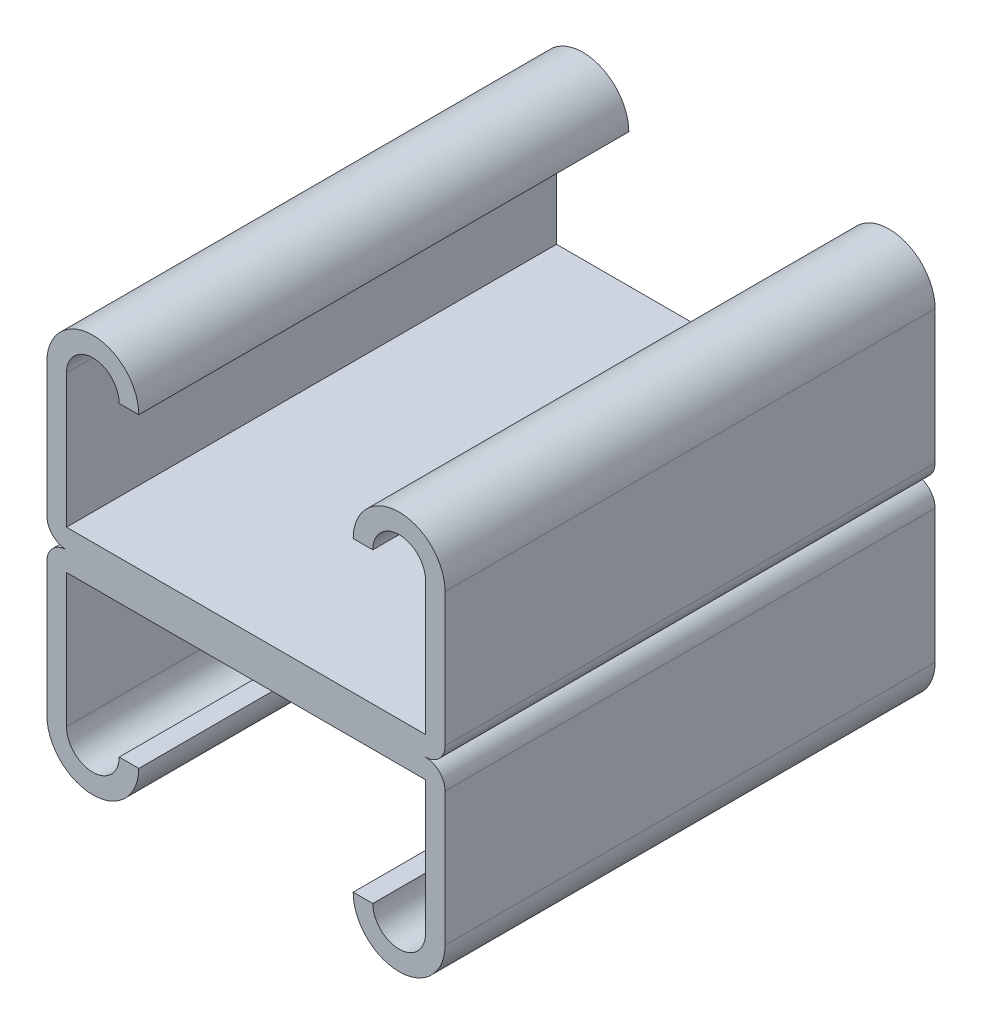
ISO-10303-21;
HEADER;
FILE_DESCRIPTION(('STEP AP214'),'2;1');
FILE_NAME('part.step','',(''),(''),'','','');
FILE_SCHEMA(('AUTOMOTIVE_DESIGN { 1 0 10303 214 1 1 1 1 }'));
ENDSEC;
DATA;
#1=APPLICATION_CONTEXT('core data for automotive mechanical design processes');
#2=APPLICATION_PROTOCOL_DEFINITION('international standard','automotive_design',2000,#1);
#3=PRODUCT_CONTEXT('',#1,'mechanical');
#4=PRODUCT('Part','Part','',(#3));
#5=PRODUCT_RELATED_PRODUCT_CATEGORY('part','',(#4));
#6=PRODUCT_DEFINITION_FORMATION('','',#4);
#7=PRODUCT_DEFINITION_CONTEXT('part definition',#1,'design');
#8=PRODUCT_DEFINITION('design','',#6,#7);
#9=PRODUCT_DEFINITION_SHAPE('','',#8);
#10=(LENGTH_UNIT() NAMED_UNIT(*) SI_UNIT(.MILLI.,.METRE.));
#11=(NAMED_UNIT(*) PLANE_ANGLE_UNIT() SI_UNIT($,.RADIAN.));
#12=(NAMED_UNIT(*) SI_UNIT($,.STERADIAN.) SOLID_ANGLE_UNIT());
#13=UNCERTAINTY_MEASURE_WITH_UNIT(LENGTH_MEASURE(1.E-05),#10,'distance_accuracy_value','');
#14=(GEOMETRIC_REPRESENTATION_CONTEXT(3) GLOBAL_UNCERTAINTY_ASSIGNED_CONTEXT((#13)) GLOBAL_UNIT_ASSIGNED_CONTEXT((#10,
#11,#12)) REPRESENTATION_CONTEXT('',''));
#15=CARTESIAN_POINT('',(0.,0.,0.));
#16=DIRECTION('',(0.,0.,1.));
#17=DIRECTION('',(1.,0.,0.));
#18=AXIS2_PLACEMENT_3D('',#15,#16,#17);
#19=CARTESIAN_POINT('',(-7.9375,7.9375,12.7));
#20=DIRECTION('',(0.,0.,-1.));
#21=DIRECTION('',(-1.,0.,0.));
#22=AXIS2_PLACEMENT_3D('',#19,#20,#21);
#23=CYLINDRICAL_SURFACE('',#22,2.38125);
#24=CARTESIAN_POINT('',(-7.9375,7.9375,-12.7));
#25=DIRECTION('',(0.,0.,1.));
#26=DIRECTION('',(-1.,0.,0.));
#27=AXIS2_PLACEMENT_3D('',#24,#25,#26);
#28=CIRCLE('',#27,2.38125);
#29=CARTESIAN_POINT('',(-5.55625,7.9375,-12.7));
#30=VERTEX_POINT('',#29);
#31=CARTESIAN_POINT('',(-10.31875,7.9375,-12.7));
#32=VERTEX_POINT('',#31);
#33=EDGE_CURVE('E165',#30,#32,#28,.T.);
#34=ORIENTED_EDGE('',*,*,#33,.T.);
#35=DIRECTION('',(0.,0.,-1.));
#36=VECTOR('',#35,1.);
#37=CARTESIAN_POINT('',(-10.31875,7.9375,12.7));
#38=LINE('',#37,#36);
#39=CARTESIAN_POINT('',(-10.31875,7.9375,12.7));
#40=VERTEX_POINT('',#39);
#41=EDGE_CURVE('E11',#40,#32,#38,.T.);
#42=ORIENTED_EDGE('',*,*,#41,.F.);
#43=CARTESIAN_POINT('',(-7.9375,7.9375,12.7));
#44=DIRECTION('',(0.,0.,1.));
#45=DIRECTION('',(-1.,0.,0.));
#46=AXIS2_PLACEMENT_3D('',#43,#44,#45);
#47=CIRCLE('',#46,2.38125);
#48=CARTESIAN_POINT('',(-5.55625,7.9375,12.7));
#49=VERTEX_POINT('',#48);
#50=EDGE_CURVE('E190',#49,#40,#47,.T.);
#51=ORIENTED_EDGE('',*,*,#50,.F.);
#52=DIRECTION('',(0.,0.,-1.));
#53=VECTOR('',#52,1.);
#54=CARTESIAN_POINT('',(-5.55625,7.9375,12.7));
#55=LINE('',#54,#53);
#56=EDGE_CURVE('E161',#49,#30,#55,.T.);
#57=ORIENTED_EDGE('',*,*,#56,.T.);
#58=EDGE_LOOP('',(#34,#42,#51,#57));
#59=FACE_BOUND('',#58,.T.);
#60=ADVANCED_FACE('F32',(#59),#23,.T.);
#61=CARTESIAN_POINT('',(-10.31875,7.9375,12.7));
#62=DIRECTION('',(1.,0.,0.));
#63=DIRECTION('',(0.,1.,0.));
#64=AXIS2_PLACEMENT_3D('',#61,#62,#63);
#65=PLANE('',#64);
#66=DIRECTION('',(0.,-1.,0.));
#67=VECTOR('',#66,1.);
#68=CARTESIAN_POINT('',(-10.31875,7.9375,-12.7));
#69=LINE('',#68,#67);
#70=CARTESIAN_POINT('',(-10.31875,1.016,-12.7));
#71=VERTEX_POINT('',#70);
#72=EDGE_CURVE('E168',#32,#71,#69,.T.);
#73=ORIENTED_EDGE('',*,*,#72,.T.);
#74=DIRECTION('',(0.,0.,-1.));
#75=VECTOR('',#74,1.);
#76=CARTESIAN_POINT('',(-10.31875,1.016,12.7));
#77=LINE('',#76,#75);
#78=CARTESIAN_POINT('',(-10.31875,1.016,12.7));
#79=VERTEX_POINT('',#78);
#80=EDGE_CURVE('E40',#79,#71,#77,.T.);
#81=ORIENTED_EDGE('',*,*,#80,.F.);
#82=DIRECTION('',(0.,-1.,0.));
#83=VECTOR('',#82,1.);
#84=CARTESIAN_POINT('',(-10.31875,7.9375,12.7));
#85=LINE('',#84,#83);
#86=EDGE_CURVE('E107',#40,#79,#85,.T.);
#87=ORIENTED_EDGE('',*,*,#86,.F.);
#88=ORIENTED_EDGE('',*,*,#41,.T.);
#89=EDGE_LOOP('',(#73,#81,#87,#88));
#90=FACE_BOUND('',#89,.T.);
#91=ADVANCED_FACE('F320',(#90),#65,.F.);
#92=CARTESIAN_POINT('',(-9.30275,1.016,12.7));
#93=DIRECTION('',(0.,0.,-1.));
#94=DIRECTION('',(-1.,0.,0.));
#95=AXIS2_PLACEMENT_3D('',#92,#93,#94);
#96=CYLINDRICAL_SURFACE('',#95,1.016);
#97=CARTESIAN_POINT('',(-9.30275,1.016,-12.7));
#98=DIRECTION('',(0.,0.,1.));
#99=DIRECTION('',(-1.,0.,0.));
#100=AXIS2_PLACEMENT_3D('',#97,#98,#99);
#101=CIRCLE('',#100,1.016);
#102=CARTESIAN_POINT('',(-9.30275,0.,-12.7));
#103=VERTEX_POINT('',#102);
#104=EDGE_CURVE('E171',#71,#103,#101,.T.);
#105=ORIENTED_EDGE('',*,*,#104,.T.);
#106=DIRECTION('',(0.,0.,-1.));
#107=VECTOR('',#106,1.);
#108=CARTESIAN_POINT('',(-9.30275,0.,12.7));
#109=LINE('',#108,#107);
#110=CARTESIAN_POINT('',(-9.30275,0.,12.7));
#111=VERTEX_POINT('',#110);
#112=EDGE_CURVE('E215',#111,#103,#109,.T.);
#113=ORIENTED_EDGE('',*,*,#112,.F.);
#114=CARTESIAN_POINT('',(-9.30275,1.016,12.7));
#115=DIRECTION('',(0.,0.,1.));
#116=DIRECTION('',(-1.,0.,0.));
#117=AXIS2_PLACEMENT_3D('',#114,#115,#116);
#118=CIRCLE('',#117,1.016);
#119=EDGE_CURVE('E223',#79,#111,#118,.T.);
#120=ORIENTED_EDGE('',*,*,#119,.F.);
#121=ORIENTED_EDGE('',*,*,#80,.T.);
#122=EDGE_LOOP('',(#105,#113,#120,#121));
#123=FACE_BOUND('',#122,.T.);
#124=ADVANCED_FACE('F221',(#123),#96,.T.);
#125=CARTESIAN_POINT('',(9.30275,1.016,12.7));
#126=DIRECTION('',(0.,0.,-1.));
#127=DIRECTION('',(-1.,0.,0.));
#128=AXIS2_PLACEMENT_3D('',#125,#126,#127);
#129=CYLINDRICAL_SURFACE('',#128,1.016);
#130=CARTESIAN_POINT('',(9.30275,1.016,-12.7));
#131=DIRECTION('',(0.,0.,1.));
#132=DIRECTION('',(1.,0.,0.));
#133=AXIS2_PLACEMENT_3D('',#130,#131,#132);
#134=CIRCLE('',#133,1.016);
#135=CARTESIAN_POINT('',(9.30275,0.,-12.7));
#136=VERTEX_POINT('',#135);
#137=CARTESIAN_POINT('',(10.31875,1.016,-12.7));
#138=VERTEX_POINT('',#137);
#139=EDGE_CURVE('E173',#136,#138,#134,.T.);
#140=ORIENTED_EDGE('',*,*,#139,.T.);
#141=DIRECTION('',(0.,0.,-1.));
#142=VECTOR('',#141,1.);
#143=CARTESIAN_POINT('',(10.31875,1.016,12.7));
#144=LINE('',#143,#142);
#145=CARTESIAN_POINT('',(10.31875,1.016,12.7));
#146=VERTEX_POINT('',#145);
#147=EDGE_CURVE('E209',#146,#138,#144,.T.);
#148=ORIENTED_EDGE('',*,*,#147,.F.);
#149=CARTESIAN_POINT('',(9.30275,1.016,12.7));
#150=DIRECTION('',(0.,0.,1.));
#151=DIRECTION('',(1.,0.,0.));
#152=AXIS2_PLACEMENT_3D('',#149,#150,#151);
#153=CIRCLE('',#152,1.016);
#154=CARTESIAN_POINT('',(9.30275,0.,12.7));
#155=VERTEX_POINT('',#154);
#156=EDGE_CURVE('E285',#155,#146,#153,.T.);
#157=ORIENTED_EDGE('',*,*,#156,.F.);
#158=DIRECTION('',(0.,0.,-1.));
#159=VECTOR('',#158,1.);
#160=CARTESIAN_POINT('',(9.30275,0.,12.7));
#161=LINE('',#160,#159);
#162=EDGE_CURVE('E212',#155,#136,#161,.T.);
#163=ORIENTED_EDGE('',*,*,#162,.T.);
#164=EDGE_LOOP('',(#140,#148,#157,#163));
#165=FACE_BOUND('',#164,.T.);
#166=ADVANCED_FACE('F327',(#165),#129,.T.);
#167=CARTESIAN_POINT('',(10.31875,1.016,12.7));
#168=DIRECTION('',(-1.,0.,0.));
#169=DIRECTION('',(0.,-1.,0.));
#170=AXIS2_PLACEMENT_3D('',#167,#168,#169);
#171=PLANE('',#170);
#172=DIRECTION('',(0.,1.,0.));
#173=VECTOR('',#172,1.);
#174=CARTESIAN_POINT('',(10.31875,1.016,-12.7));
#175=LINE('',#174,#173);
#176=CARTESIAN_POINT('',(10.31875,7.9375,-12.7));
#177=VERTEX_POINT('',#176);
#178=EDGE_CURVE('E175',#138,#177,#175,.T.);
#179=ORIENTED_EDGE('',*,*,#178,.T.);
#180=DIRECTION('',(0.,0.,-1.));
#181=VECTOR('',#180,1.);
#182=CARTESIAN_POINT('',(10.31875,7.9375,12.7));
#183=LINE('',#182,#181);
#184=CARTESIAN_POINT('',(10.31875,7.9375,12.7));
#185=VERTEX_POINT('',#184);
#186=EDGE_CURVE('E206',#185,#177,#183,.T.);
#187=ORIENTED_EDGE('',*,*,#186,.F.);
#188=DIRECTION('',(0.,1.,0.));
#189=VECTOR('',#188,1.);
#190=CARTESIAN_POINT('',(10.31875,1.016,12.7));
#191=LINE('',#190,#189);
#192=EDGE_CURVE('E287',#146,#185,#191,.T.);
#193=ORIENTED_EDGE('',*,*,#192,.F.);
#194=ORIENTED_EDGE('',*,*,#147,.T.);
#195=EDGE_LOOP('',(#179,#187,#193,#194));
#196=FACE_BOUND('',#195,.T.);
#197=ADVANCED_FACE('F332',(#196),#171,.F.);
#198=CARTESIAN_POINT('',(7.9375,7.9375,12.7));
#199=DIRECTION('',(0.,0.,-1.));
#200=DIRECTION('',(-1.,0.,0.));
#201=AXIS2_PLACEMENT_3D('',#198,#199,#200);
#202=CYLINDRICAL_SURFACE('',#201,2.38125);
#203=CARTESIAN_POINT('',(7.9375,7.9375,-12.7));
#204=DIRECTION('',(0.,0.,1.));
#205=DIRECTION('',(1.,0.,0.));
#206=AXIS2_PLACEMENT_3D('',#203,#204,#205);
#207=CIRCLE('',#206,2.38125);
#208=CARTESIAN_POINT('',(5.55625,7.9375,-12.7));
#209=VERTEX_POINT('',#208);
#210=EDGE_CURVE('E177',#177,#209,#207,.T.);
#211=ORIENTED_EDGE('',*,*,#210,.T.);
#212=DIRECTION('',(0.,0.,-1.));
#213=VECTOR('',#212,1.);
#214=CARTESIAN_POINT('',(5.55625,7.9375,12.7));
#215=LINE('',#214,#213);
#216=CARTESIAN_POINT('',(5.55625,7.9375,12.7));
#217=VERTEX_POINT('',#216);
#218=EDGE_CURVE('E203',#217,#209,#215,.T.);
#219=ORIENTED_EDGE('',*,*,#218,.F.);
#220=CARTESIAN_POINT('',(7.9375,7.9375,12.7));
#221=DIRECTION('',(0.,0.,1.));
#222=DIRECTION('',(1.,0.,0.));
#223=AXIS2_PLACEMENT_3D('',#220,#221,#222);
#224=CIRCLE('',#223,2.38125);
#225=EDGE_CURVE('E289',#185,#217,#224,.T.);
#226=ORIENTED_EDGE('',*,*,#225,.F.);
#227=ORIENTED_EDGE('',*,*,#186,.T.);
#228=EDGE_LOOP('',(#211,#219,#226,#227));
#229=FACE_BOUND('',#228,.T.);
#230=ADVANCED_FACE('F336',(#229),#202,.T.);
#231=CARTESIAN_POINT('',(5.55625,7.9375,12.7));
#232=DIRECTION('',(0.,1.,0.));
#233=DIRECTION('',(0.,0.,1.));
#234=AXIS2_PLACEMENT_3D('',#231,#232,#233);
#235=PLANE('',#234);
#236=DIRECTION('',(1.,0.,0.));
#237=VECTOR('',#236,1.);
#238=CARTESIAN_POINT('',(5.55625,7.9375,-12.7));
#239=LINE('',#238,#237);
#240=CARTESIAN_POINT('',(6.57225,7.9375,-12.7));
#241=VERTEX_POINT('',#240);
#242=EDGE_CURVE('E179',#209,#241,#239,.T.);
#243=ORIENTED_EDGE('',*,*,#242,.T.);
#244=DIRECTION('',(0.,0.,-1.));
#245=VECTOR('',#244,1.);
#246=CARTESIAN_POINT('',(6.57225,7.9375,12.7));
#247=LINE('',#246,#245);
#248=CARTESIAN_POINT('',(6.57225,7.9375,12.7));
#249=VERTEX_POINT('',#248);
#250=EDGE_CURVE('E200',#249,#241,#247,.T.);
#251=ORIENTED_EDGE('',*,*,#250,.F.);
#252=DIRECTION('',(1.,0.,0.));
#253=VECTOR('',#252,1.);
#254=CARTESIAN_POINT('',(5.55625,7.9375,12.7));
#255=LINE('',#254,#253);
#256=EDGE_CURVE('E291',#217,#249,#255,.T.);
#257=ORIENTED_EDGE('',*,*,#256,.F.);
#258=ORIENTED_EDGE('',*,*,#218,.T.);
#259=EDGE_LOOP('',(#243,#251,#257,#258));
#260=FACE_BOUND('',#259,.T.);
#261=ADVANCED_FACE('F340',(#260),#235,.F.);
#262=CARTESIAN_POINT('',(7.9375,7.9375,12.7));
#263=DIRECTION('',(0.,0.,-1.));
#264=DIRECTION('',(-1.,0.,0.));
#265=AXIS2_PLACEMENT_3D('',#262,#263,#264);
#266=CYLINDRICAL_SURFACE('',#265,1.36525);
#267=CARTESIAN_POINT('',(7.9375,7.9375,-12.7));
#268=DIRECTION('',(0.,0.,-1.));
#269=DIRECTION('',(1.,0.,0.));
#270=AXIS2_PLACEMENT_3D('',#267,#268,#269);
#271=CIRCLE('',#270,1.36525);
#272=CARTESIAN_POINT('',(9.30275,7.9375,-12.7));
#273=VERTEX_POINT('',#272);
#274=EDGE_CURVE('E181',#241,#273,#271,.T.);
#275=ORIENTED_EDGE('',*,*,#274,.T.);
#276=DIRECTION('',(0.,0.,-1.));
#277=VECTOR('',#276,1.);
#278=CARTESIAN_POINT('',(9.30275,7.9375,12.7));
#279=LINE('',#278,#277);
#280=CARTESIAN_POINT('',(9.30275,7.9375,12.7));
#281=VERTEX_POINT('',#280);
#282=EDGE_CURVE('E197',#281,#273,#279,.T.);
#283=ORIENTED_EDGE('',*,*,#282,.F.);
#284=CARTESIAN_POINT('',(7.9375,7.9375,12.7));
#285=DIRECTION('',(0.,0.,-1.));
#286=DIRECTION('',(1.,0.,0.));
#287=AXIS2_PLACEMENT_3D('',#284,#285,#286);
#288=CIRCLE('',#287,1.36525);
#289=EDGE_CURVE('E293',#249,#281,#288,.T.);
#290=ORIENTED_EDGE('',*,*,#289,.F.);
#291=ORIENTED_EDGE('',*,*,#250,.T.);
#292=EDGE_LOOP('',(#275,#283,#290,#291));
#293=FACE_BOUND('',#292,.T.);
#294=ADVANCED_FACE('F344',(#293),#266,.F.);
#295=CARTESIAN_POINT('',(9.30275,1.016,12.7));
#296=DIRECTION('',(1.,0.,0.));
#297=DIRECTION('',(0.,1.,0.));
#298=AXIS2_PLACEMENT_3D('',#295,#296,#297);
#299=PLANE('',#298);
#300=DIRECTION('',(0.,-1.,0.));
#301=VECTOR('',#300,1.);
#302=CARTESIAN_POINT('',(9.30275,1.016,-12.7));
#303=LINE('',#302,#301);
#304=CARTESIAN_POINT('',(9.30275,1.016,-12.7));
#305=VERTEX_POINT('',#304);
#306=EDGE_CURVE('E183',#273,#305,#303,.T.);
#307=ORIENTED_EDGE('',*,*,#306,.T.);
#308=DIRECTION('',(0.,0.,-1.));
#309=VECTOR('',#308,1.);
#310=CARTESIAN_POINT('',(9.30275,1.016,12.7));
#311=LINE('',#310,#309);
#312=CARTESIAN_POINT('',(9.30275,1.016,12.7));
#313=VERTEX_POINT('',#312);
#314=EDGE_CURVE('E194',#313,#305,#311,.T.);
#315=ORIENTED_EDGE('',*,*,#314,.F.);
#316=DIRECTION('',(0.,-1.,0.));
#317=VECTOR('',#316,1.);
#318=CARTESIAN_POINT('',(9.30275,1.016,12.7));
#319=LINE('',#318,#317);
#320=EDGE_CURVE('E295',#281,#313,#319,.T.);
#321=ORIENTED_EDGE('',*,*,#320,.F.);
#322=ORIENTED_EDGE('',*,*,#282,.T.);
#323=EDGE_LOOP('',(#307,#315,#321,#322));
#324=FACE_BOUND('',#323,.T.);
#325=ADVANCED_FACE('F301',(#324),#299,.F.);
#326=CARTESIAN_POINT('',(-9.30275,1.016,12.7));
#327=DIRECTION('',(0.,-1.,0.));
#328=DIRECTION('',(1.,0.,0.));
#329=AXIS2_PLACEMENT_3D('',#326,#327,#328);
#330=PLANE('',#329);
#331=DIRECTION('',(-1.,0.,0.));
#332=VECTOR('',#331,1.);
#333=CARTESIAN_POINT('',(-9.30275,1.016,-12.7));
#334=LINE('',#333,#332);
#335=CARTESIAN_POINT('',(-9.30275,1.016,-12.7));
#336=VERTEX_POINT('',#335);
#337=EDGE_CURVE('E185',#305,#336,#334,.T.);
#338=ORIENTED_EDGE('',*,*,#337,.T.);
#339=DIRECTION('',(0.,0.,-1.));
#340=VECTOR('',#339,1.);
#341=CARTESIAN_POINT('',(-9.30275,1.016,12.7));
#342=LINE('',#341,#340);
#343=CARTESIAN_POINT('',(-9.30275,1.016,12.7));
#344=VERTEX_POINT('',#343);
#345=EDGE_CURVE('E156',#344,#336,#342,.T.);
#346=ORIENTED_EDGE('',*,*,#345,.F.);
#347=DIRECTION('',(-1.,0.,0.));
#348=VECTOR('',#347,1.);
#349=CARTESIAN_POINT('',(-9.30275,1.016,12.7));
#350=LINE('',#349,#348);
#351=EDGE_CURVE('E147',#313,#344,#350,.T.);
#352=ORIENTED_EDGE('',*,*,#351,.F.);
#353=ORIENTED_EDGE('',*,*,#314,.T.);
#354=EDGE_LOOP('',(#338,#346,#352,#353));
#355=FACE_BOUND('',#354,.T.);
#356=ADVANCED_FACE('F305',(#355),#330,.F.);
#357=CARTESIAN_POINT('',(-9.30275,7.9375,12.7));
#358=DIRECTION('',(-1.,0.,0.));
#359=DIRECTION('',(0.,-1.,0.));
#360=AXIS2_PLACEMENT_3D('',#357,#358,#359);
#361=PLANE('',#360);
#362=DIRECTION('',(0.,1.,0.));
#363=VECTOR('',#362,1.);
#364=CARTESIAN_POINT('',(-9.30275,7.9375,-12.7));
#365=LINE('',#364,#363);
#366=CARTESIAN_POINT('',(-9.30275,7.9375,-12.7));
#367=VERTEX_POINT('',#366);
#368=EDGE_CURVE('E155',#336,#367,#365,.T.);
#369=ORIENTED_EDGE('',*,*,#368,.T.);
#370=DIRECTION('',(0.,0.,-1.));
#371=VECTOR('',#370,1.);
#372=CARTESIAN_POINT('',(-9.30275,7.9375,12.7));
#373=LINE('',#372,#371);
#374=CARTESIAN_POINT('',(-9.30275,7.9375,12.7));
#375=VERTEX_POINT('',#374);
#376=EDGE_CURVE('E152',#375,#367,#373,.T.);
#377=ORIENTED_EDGE('',*,*,#376,.F.);
#378=DIRECTION('',(0.,1.,0.));
#379=VECTOR('',#378,1.);
#380=CARTESIAN_POINT('',(-9.30275,7.9375,12.7));
#381=LINE('',#380,#379);
#382=EDGE_CURVE('E141',#344,#375,#381,.T.);
#383=ORIENTED_EDGE('',*,*,#382,.F.);
#384=ORIENTED_EDGE('',*,*,#345,.T.);
#385=EDGE_LOOP('',(#369,#377,#383,#384));
#386=FACE_BOUND('',#385,.T.);
#387=ADVANCED_FACE('F153',(#386),#361,.F.);
#388=CARTESIAN_POINT('',(-7.9375,7.9375,12.7));
#389=DIRECTION('',(0.,0.,-1.));
#390=DIRECTION('',(-1.,0.,0.));
#391=AXIS2_PLACEMENT_3D('',#388,#389,#390);
#392=CYLINDRICAL_SURFACE('',#391,1.36525);
#393=CARTESIAN_POINT('',(-7.9375,7.9375,-12.7));
#394=DIRECTION('',(0.,0.,-1.));
#395=DIRECTION('',(-1.,0.,0.));
#396=AXIS2_PLACEMENT_3D('',#393,#394,#395);
#397=CIRCLE('',#396,1.36525);
#398=CARTESIAN_POINT('',(-6.57225,7.9375,-12.7));
#399=VERTEX_POINT('',#398);
#400=EDGE_CURVE('E93',#367,#399,#397,.T.);
#401=ORIENTED_EDGE('',*,*,#400,.T.);
#402=DIRECTION('',(0.,0.,-1.));
#403=VECTOR('',#402,1.);
#404=CARTESIAN_POINT('',(-6.57225,7.9375,12.7));
#405=LINE('',#404,#403);
#406=CARTESIAN_POINT('',(-6.57225,7.9375,12.7));
#407=VERTEX_POINT('',#406);
#408=EDGE_CURVE('E157',#407,#399,#405,.T.);
#409=ORIENTED_EDGE('',*,*,#408,.F.);
#410=CARTESIAN_POINT('',(-7.9375,7.9375,12.7));
#411=DIRECTION('',(0.,0.,-1.));
#412=DIRECTION('',(-1.,0.,0.));
#413=AXIS2_PLACEMENT_3D('',#410,#411,#412);
#414=CIRCLE('',#413,1.36525);
#415=EDGE_CURVE('E145',#375,#407,#414,.T.);
#416=ORIENTED_EDGE('',*,*,#415,.F.);
#417=ORIENTED_EDGE('',*,*,#376,.T.);
#418=EDGE_LOOP('',(#401,#409,#416,#417));
#419=FACE_BOUND('',#418,.T.);
#420=ADVANCED_FACE('F159',(#419),#392,.F.);
#421=CARTESIAN_POINT('',(-6.57225,7.9375,12.7));
#422=DIRECTION('',(0.,1.,0.));
#423=DIRECTION('',(0.,0.,1.));
#424=AXIS2_PLACEMENT_3D('',#421,#422,#423);
#425=PLANE('',#424);
#426=DIRECTION('',(1.,0.,0.));
#427=VECTOR('',#426,1.);
#428=CARTESIAN_POINT('',(-6.57225,7.9375,-12.7));
#429=LINE('',#428,#427);
#430=EDGE_CURVE('E99',#399,#30,#429,.T.);
#431=ORIENTED_EDGE('',*,*,#430,.T.);
#432=ORIENTED_EDGE('',*,*,#56,.F.);
#433=DIRECTION('',(1.,0.,0.));
#434=VECTOR('',#433,1.);
#435=CARTESIAN_POINT('',(-6.57225,7.9375,12.7));
#436=LINE('',#435,#434);
#437=EDGE_CURVE('E48',#407,#49,#436,.T.);
#438=ORIENTED_EDGE('',*,*,#437,.F.);
#439=ORIENTED_EDGE('',*,*,#408,.T.);
#440=EDGE_LOOP('',(#431,#432,#438,#439));
#441=FACE_BOUND('',#440,.T.);
#442=ADVANCED_FACE('F309',(#441),#425,.F.);
#443=CARTESIAN_POINT('',(-7.9375,7.9375,12.7));
#444=DIRECTION('',(0.,0.,-1.));
#445=DIRECTION('',(-1.,0.,0.));
#446=AXIS2_PLACEMENT_3D('',#443,#444,#445);
#447=PLANE('',#446);
#448=ORIENTED_EDGE('',*,*,#50,.T.);
#449=ORIENTED_EDGE('',*,*,#86,.T.);
#450=ORIENTED_EDGE('',*,*,#119,.T.);
#451=CARTESIAN_POINT('',(-9.30275,-1.016,12.7));
#452=DIRECTION('',(0.,0.,-1.));
#453=DIRECTION('',(-1.,0.,0.));
#454=AXIS2_PLACEMENT_3D('',#451,#452,#453);
#455=CIRCLE('',#454,1.016);
#456=CARTESIAN_POINT('',(-10.31875,-1.016,12.7));
#457=VERTEX_POINT('',#456);
#458=EDGE_CURVE('E630',#457,#111,#455,.T.);
#459=ORIENTED_EDGE('',*,*,#458,.F.);
#460=DIRECTION('',(0.,1.,0.));
#461=VECTOR('',#460,1.);
#462=CARTESIAN_POINT('',(-10.31875,-7.9375,12.7));
#463=LINE('',#462,#461);
#464=CARTESIAN_POINT('',(-10.31875,-7.9375,12.7));
#465=VERTEX_POINT('',#464);
#466=EDGE_CURVE('E250',#465,#457,#463,.T.);
#467=ORIENTED_EDGE('',*,*,#466,.F.);
#468=CARTESIAN_POINT('',(-7.9375,-7.9375,12.7));
#469=DIRECTION('',(0.,0.,-1.));
#470=DIRECTION('',(-1.,0.,0.));
#471=AXIS2_PLACEMENT_3D('',#468,#469,#470);
#472=CIRCLE('',#471,2.38125);
#473=CARTESIAN_POINT('',(-5.55625,-7.9375,12.7));
#474=VERTEX_POINT('',#473);
#475=EDGE_CURVE('E239',#474,#465,#472,.T.);
#476=ORIENTED_EDGE('',*,*,#475,.F.);
#477=DIRECTION('',(1.,0.,0.));
#478=VECTOR('',#477,1.);
#479=CARTESIAN_POINT('',(-6.57225,-7.9375,12.7));
#480=LINE('',#479,#478);
#481=CARTESIAN_POINT('',(-6.57225,-7.9375,12.7));
#482=VERTEX_POINT('',#481);
#483=EDGE_CURVE('E591',#482,#474,#480,.T.);
#484=ORIENTED_EDGE('',*,*,#483,.F.);
#485=CARTESIAN_POINT('',(-7.9375,-7.9375,12.7));
#486=DIRECTION('',(0.,0.,1.));
#487=DIRECTION('',(-1.,0.,0.));
#488=AXIS2_PLACEMENT_3D('',#485,#486,#487);
#489=CIRCLE('',#488,1.36525);
#490=CARTESIAN_POINT('',(-9.30275,-7.9375,12.7));
#491=VERTEX_POINT('',#490);
#492=EDGE_CURVE('E600',#491,#482,#489,.T.);
#493=ORIENTED_EDGE('',*,*,#492,.F.);
#494=DIRECTION('',(0.,-1.,0.));
#495=VECTOR('',#494,1.);
#496=CARTESIAN_POINT('',(-9.30275,-7.9375,12.7));
#497=LINE('',#496,#495);
#498=CARTESIAN_POINT('',(-9.30275,-1.016,12.7));
#499=VERTEX_POINT('',#498);
#500=EDGE_CURVE('E604',#499,#491,#497,.T.);
#501=ORIENTED_EDGE('',*,*,#500,.F.);
#502=DIRECTION('',(-1.,0.,0.));
#503=VECTOR('',#502,1.);
#504=CARTESIAN_POINT('',(-9.30275,-1.016,12.7));
#505=LINE('',#504,#503);
#506=CARTESIAN_POINT('',(9.30275,-1.016,12.7));
#507=VERTEX_POINT('',#506);
#508=EDGE_CURVE('E606',#507,#499,#505,.T.);
#509=ORIENTED_EDGE('',*,*,#508,.F.);
#510=DIRECTION('',(0.,1.,0.));
#511=VECTOR('',#510,1.);
#512=CARTESIAN_POINT('',(9.30275,-1.016,12.7));
#513=LINE('',#512,#511);
#514=CARTESIAN_POINT('',(9.30275,-7.9375,12.7));
#515=VERTEX_POINT('',#514);
#516=EDGE_CURVE('E612',#515,#507,#513,.T.);
#517=ORIENTED_EDGE('',*,*,#516,.F.);
#518=CARTESIAN_POINT('',(7.9375,-7.9375,12.7));
#519=DIRECTION('',(0.,0.,1.));
#520=DIRECTION('',(1.,0.,0.));
#521=AXIS2_PLACEMENT_3D('',#518,#519,#520);
#522=CIRCLE('',#521,1.36525);
#523=CARTESIAN_POINT('',(6.57225,-7.9375,12.7));
#524=VERTEX_POINT('',#523);
#525=EDGE_CURVE('E615',#524,#515,#522,.T.);
#526=ORIENTED_EDGE('',*,*,#525,.F.);
#527=DIRECTION('',(1.,0.,0.));
#528=VECTOR('',#527,1.);
#529=CARTESIAN_POINT('',(5.55625,-7.9375,12.7));
#530=LINE('',#529,#528);
#531=CARTESIAN_POINT('',(5.55625,-7.9375,12.7));
#532=VERTEX_POINT('',#531);
#533=EDGE_CURVE('E618',#532,#524,#530,.T.);
#534=ORIENTED_EDGE('',*,*,#533,.F.);
#535=CARTESIAN_POINT('',(7.9375,-7.9375,12.7));
#536=DIRECTION('',(0.,0.,-1.));
#537=DIRECTION('',(1.,0.,0.));
#538=AXIS2_PLACEMENT_3D('',#535,#536,#537);
#539=CIRCLE('',#538,2.38125);
#540=CARTESIAN_POINT('',(10.31875,-7.9375,12.7));
#541=VERTEX_POINT('',#540);
#542=EDGE_CURVE('E621',#541,#532,#539,.T.);
#543=ORIENTED_EDGE('',*,*,#542,.F.);
#544=DIRECTION('',(0.,-1.,0.));
#545=VECTOR('',#544,1.);
#546=CARTESIAN_POINT('',(10.31875,-1.016,12.7));
#547=LINE('',#546,#545);
#548=CARTESIAN_POINT('',(10.31875,-1.016,12.7));
#549=VERTEX_POINT('',#548);
#550=EDGE_CURVE('E624',#549,#541,#547,.T.);
#551=ORIENTED_EDGE('',*,*,#550,.F.);
#552=CARTESIAN_POINT('',(9.30275,-1.016,12.7));
#553=DIRECTION('',(0.,0.,-1.));
#554=DIRECTION('',(1.,0.,0.));
#555=AXIS2_PLACEMENT_3D('',#552,#553,#554);
#556=CIRCLE('',#555,1.016);
#557=EDGE_CURVE('E627',#155,#549,#556,.T.);
#558=ORIENTED_EDGE('',*,*,#557,.F.);
#559=ORIENTED_EDGE('',*,*,#156,.T.);
#560=ORIENTED_EDGE('',*,*,#192,.T.);
#561=ORIENTED_EDGE('',*,*,#225,.T.);
#562=ORIENTED_EDGE('',*,*,#256,.T.);
#563=ORIENTED_EDGE('',*,*,#289,.T.);
#564=ORIENTED_EDGE('',*,*,#320,.T.);
#565=ORIENTED_EDGE('',*,*,#351,.T.);
#566=ORIENTED_EDGE('',*,*,#382,.T.);
#567=ORIENTED_EDGE('',*,*,#415,.T.);
#568=ORIENTED_EDGE('',*,*,#437,.T.);
#569=EDGE_LOOP('',(#448,#449,#450,#459,#467,#476,#484,#493,#501,#509,#517,#526,#534,#543,#551,
#558,#559,#560,#561,#562,#563,#564,#565,#566,#567,#568));
#570=FACE_BOUND('',#569,.T.);
#571=ADVANCED_FACE('F143',(#570),#447,.F.);
#572=CARTESIAN_POINT('',(-7.9375,7.9375,-12.7));
#573=DIRECTION('',(0.,0.,-1.));
#574=DIRECTION('',(-1.,0.,0.));
#575=AXIS2_PLACEMENT_3D('',#572,#573,#574);
#576=PLANE('',#575);
#577=ORIENTED_EDGE('',*,*,#33,.F.);
#578=ORIENTED_EDGE('',*,*,#430,.F.);
#579=ORIENTED_EDGE('',*,*,#400,.F.);
#580=ORIENTED_EDGE('',*,*,#368,.F.);
#581=ORIENTED_EDGE('',*,*,#337,.F.);
#582=ORIENTED_EDGE('',*,*,#306,.F.);
#583=ORIENTED_EDGE('',*,*,#274,.F.);
#584=ORIENTED_EDGE('',*,*,#242,.F.);
#585=ORIENTED_EDGE('',*,*,#210,.F.);
#586=ORIENTED_EDGE('',*,*,#178,.F.);
#587=ORIENTED_EDGE('',*,*,#139,.F.);
#588=CARTESIAN_POINT('',(9.30275,-1.016,-12.7));
#589=DIRECTION('',(0.,0.,-1.));
#590=DIRECTION('',(1.,0.,0.));
#591=AXIS2_PLACEMENT_3D('',#588,#589,#590);
#592=CIRCLE('',#591,1.016);
#593=CARTESIAN_POINT('',(10.31875,-1.016,-12.7));
#594=VERTEX_POINT('',#593);
#595=EDGE_CURVE('E237',#136,#594,#592,.T.);
#596=ORIENTED_EDGE('',*,*,#595,.T.);
#597=DIRECTION('',(0.,-1.,0.));
#598=VECTOR('',#597,1.);
#599=CARTESIAN_POINT('',(10.31875,-1.016,-12.7));
#600=LINE('',#599,#598);
#601=CARTESIAN_POINT('',(10.31875,-7.9375,-12.7));
#602=VERTEX_POINT('',#601);
#603=EDGE_CURVE('E242',#594,#602,#600,.T.);
#604=ORIENTED_EDGE('',*,*,#603,.T.);
#605=CARTESIAN_POINT('',(7.9375,-7.9375,-12.7));
#606=DIRECTION('',(0.,0.,-1.));
#607=DIRECTION('',(1.,0.,0.));
#608=AXIS2_PLACEMENT_3D('',#605,#606,#607);
#609=CIRCLE('',#608,2.38125);
#610=CARTESIAN_POINT('',(5.55625,-7.9375,-12.7));
#611=VERTEX_POINT('',#610);
#612=EDGE_CURVE('E654',#602,#611,#609,.T.);
#613=ORIENTED_EDGE('',*,*,#612,.T.);
#614=DIRECTION('',(1.,0.,0.));
#615=VECTOR('',#614,1.);
#616=CARTESIAN_POINT('',(5.55625,-7.9375,-12.7));
#617=LINE('',#616,#615);
#618=CARTESIAN_POINT('',(6.57225,-7.9375,-12.7));
#619=VERTEX_POINT('',#618);
#620=EDGE_CURVE('E651',#611,#619,#617,.T.);
#621=ORIENTED_EDGE('',*,*,#620,.T.);
#622=CARTESIAN_POINT('',(7.9375,-7.9375,-12.7));
#623=DIRECTION('',(0.,0.,1.));
#624=DIRECTION('',(1.,0.,0.));
#625=AXIS2_PLACEMENT_3D('',#622,#623,#624);
#626=CIRCLE('',#625,1.36525);
#627=CARTESIAN_POINT('',(9.30275,-7.9375,-12.7));
#628=VERTEX_POINT('',#627);
#629=EDGE_CURVE('E648',#619,#628,#626,.T.);
#630=ORIENTED_EDGE('',*,*,#629,.T.);
#631=DIRECTION('',(0.,1.,0.));
#632=VECTOR('',#631,1.);
#633=CARTESIAN_POINT('',(9.30275,-1.016,-12.7));
#634=LINE('',#633,#632);
#635=CARTESIAN_POINT('',(9.30275,-1.016,-12.7));
#636=VERTEX_POINT('',#635);
#637=EDGE_CURVE('E645',#628,#636,#634,.T.);
#638=ORIENTED_EDGE('',*,*,#637,.T.);
#639=DIRECTION('',(-1.,0.,0.));
#640=VECTOR('',#639,1.);
#641=CARTESIAN_POINT('',(-9.30275,-1.016,-12.7));
#642=LINE('',#641,#640);
#643=CARTESIAN_POINT('',(-9.30275,-1.016,-12.7));
#644=VERTEX_POINT('',#643);
#645=EDGE_CURVE('E642',#636,#644,#642,.T.);
#646=ORIENTED_EDGE('',*,*,#645,.T.);
#647=DIRECTION('',(0.,-1.,0.));
#648=VECTOR('',#647,1.);
#649=CARTESIAN_POINT('',(-9.30275,-7.9375,-12.7));
#650=LINE('',#649,#648);
#651=CARTESIAN_POINT('',(-9.30275,-7.9375,-12.7));
#652=VERTEX_POINT('',#651);
#653=EDGE_CURVE('E639',#644,#652,#650,.T.);
#654=ORIENTED_EDGE('',*,*,#653,.T.);
#655=CARTESIAN_POINT('',(-7.9375,-7.9375,-12.7));
#656=DIRECTION('',(0.,0.,1.));
#657=DIRECTION('',(-1.,0.,0.));
#658=AXIS2_PLACEMENT_3D('',#655,#656,#657);
#659=CIRCLE('',#658,1.36525);
#660=CARTESIAN_POINT('',(-6.57225,-7.9375,-12.7));
#661=VERTEX_POINT('',#660);
#662=EDGE_CURVE('E637',#652,#661,#659,.T.);
#663=ORIENTED_EDGE('',*,*,#662,.T.);
#664=DIRECTION('',(1.,0.,0.));
#665=VECTOR('',#664,1.);
#666=CARTESIAN_POINT('',(-6.57225,-7.9375,-12.7));
#667=LINE('',#666,#665);
#668=CARTESIAN_POINT('',(-5.55625,-7.9375,-12.7));
#669=VERTEX_POINT('',#668);
#670=EDGE_CURVE('E593',#661,#669,#667,.T.);
#671=ORIENTED_EDGE('',*,*,#670,.T.);
#672=CARTESIAN_POINT('',(-7.9375,-7.9375,-12.7));
#673=DIRECTION('',(0.,0.,-1.));
#674=DIRECTION('',(-1.,0.,0.));
#675=AXIS2_PLACEMENT_3D('',#672,#673,#674);
#676=CIRCLE('',#675,2.38125);
#677=CARTESIAN_POINT('',(-10.31875,-7.9375,-12.7));
#678=VERTEX_POINT('',#677);
#679=EDGE_CURVE('E634',#669,#678,#676,.T.);
#680=ORIENTED_EDGE('',*,*,#679,.T.);
#681=DIRECTION('',(0.,1.,0.));
#682=VECTOR('',#681,1.);
#683=CARTESIAN_POINT('',(-10.31875,-7.9375,-12.7));
#684=LINE('',#683,#682);
#685=CARTESIAN_POINT('',(-10.31875,-1.016,-12.7));
#686=VERTEX_POINT('',#685);
#687=EDGE_CURVE('E234',#678,#686,#684,.T.);
#688=ORIENTED_EDGE('',*,*,#687,.T.);
#689=CARTESIAN_POINT('',(-9.30275,-1.016,-12.7));
#690=DIRECTION('',(0.,0.,-1.));
#691=DIRECTION('',(-1.,0.,0.));
#692=AXIS2_PLACEMENT_3D('',#689,#690,#691);
#693=CIRCLE('',#692,1.016);
#694=EDGE_CURVE('E230',#686,#103,#693,.T.);
#695=ORIENTED_EDGE('',*,*,#694,.T.);
#696=ORIENTED_EDGE('',*,*,#104,.F.);
#697=ORIENTED_EDGE('',*,*,#72,.F.);
#698=EDGE_LOOP('',(#577,#578,#579,#580,#581,#582,#583,#584,#585,#586,#587,#596,#604,#613,#621,
#630,#638,#646,#654,#663,#671,#680,#688,#695,#696,#697));
#699=FACE_BOUND('',#698,.T.);
#700=ADVANCED_FACE('F227',(#699),#576,.T.);
#701=CARTESIAN_POINT('',(-7.9375,-7.9375,12.7));
#702=DIRECTION('',(0.,0.,-1.));
#703=DIRECTION('',(-1.,0.,0.));
#704=AXIS2_PLACEMENT_3D('',#701,#702,#703);
#705=CYLINDRICAL_SURFACE('',#704,2.38125);
#706=ORIENTED_EDGE('',*,*,#679,.F.);
#707=DIRECTION('',(0.,0.,-1.));
#708=VECTOR('',#707,1.);
#709=CARTESIAN_POINT('',(-5.55625,-7.9375,12.7));
#710=LINE('',#709,#708);
#711=EDGE_CURVE('E169',#474,#669,#710,.T.);
#712=ORIENTED_EDGE('',*,*,#711,.F.);
#713=ORIENTED_EDGE('',*,*,#475,.T.);
#714=DIRECTION('',(0.,0.,-1.));
#715=VECTOR('',#714,1.);
#716=CARTESIAN_POINT('',(-10.31875,-7.9375,12.7));
#717=LINE('',#716,#715);
#718=EDGE_CURVE('E246',#465,#678,#717,.T.);
#719=ORIENTED_EDGE('',*,*,#718,.T.);
#720=EDGE_LOOP('',(#706,#712,#713,#719));
#721=FACE_BOUND('',#720,.T.);
#722=ADVANCED_FACE('F397',(#721),#705,.T.);
#723=CARTESIAN_POINT('',(-6.57225,-7.9375,12.7));
#724=DIRECTION('',(0.,1.,0.));
#725=DIRECTION('',(0.,0.,1.));
#726=AXIS2_PLACEMENT_3D('',#723,#724,#725);
#727=PLANE('',#726);
#728=ORIENTED_EDGE('',*,*,#670,.F.);
#729=DIRECTION('',(0.,0.,-1.));
#730=VECTOR('',#729,1.);
#731=CARTESIAN_POINT('',(-6.57225,-7.9375,12.7));
#732=LINE('',#731,#730);
#733=EDGE_CURVE('E277',#482,#661,#732,.T.);
#734=ORIENTED_EDGE('',*,*,#733,.F.);
#735=ORIENTED_EDGE('',*,*,#483,.T.);
#736=ORIENTED_EDGE('',*,*,#711,.T.);
#737=EDGE_LOOP('',(#728,#734,#735,#736));
#738=FACE_BOUND('',#737,.T.);
#739=ADVANCED_FACE('F405',(#738),#727,.T.);
#740=CARTESIAN_POINT('',(-7.9375,-7.9375,12.7));
#741=DIRECTION('',(0.,0.,-1.));
#742=DIRECTION('',(-1.,0.,0.));
#743=AXIS2_PLACEMENT_3D('',#740,#741,#742);
#744=CYLINDRICAL_SURFACE('',#743,1.36525);
#745=ORIENTED_EDGE('',*,*,#662,.F.);
#746=DIRECTION('',(0.,0.,-1.));
#747=VECTOR('',#746,1.);
#748=CARTESIAN_POINT('',(-9.30275,-7.9375,12.7));
#749=LINE('',#748,#747);
#750=EDGE_CURVE('E274',#491,#652,#749,.T.);
#751=ORIENTED_EDGE('',*,*,#750,.F.);
#752=ORIENTED_EDGE('',*,*,#492,.T.);
#753=ORIENTED_EDGE('',*,*,#733,.T.);
#754=EDGE_LOOP('',(#745,#751,#752,#753));
#755=FACE_BOUND('',#754,.T.);
#756=ADVANCED_FACE('F415',(#755),#744,.F.);
#757=CARTESIAN_POINT('',(-9.30275,-7.9375,12.7));
#758=DIRECTION('',(1.,0.,0.));
#759=DIRECTION('',(0.,1.,0.));
#760=AXIS2_PLACEMENT_3D('',#757,#758,#759);
#761=PLANE('',#760);
#762=ORIENTED_EDGE('',*,*,#653,.F.);
#763=DIRECTION('',(0.,0.,-1.));
#764=VECTOR('',#763,1.);
#765=CARTESIAN_POINT('',(-9.30275,-1.016,12.7));
#766=LINE('',#765,#764);
#767=EDGE_CURVE('E271',#499,#644,#766,.T.);
#768=ORIENTED_EDGE('',*,*,#767,.F.);
#769=ORIENTED_EDGE('',*,*,#500,.T.);
#770=ORIENTED_EDGE('',*,*,#750,.T.);
#771=EDGE_LOOP('',(#762,#768,#769,#770));
#772=FACE_BOUND('',#771,.T.);
#773=ADVANCED_FACE('F425',(#772),#761,.T.);
#774=CARTESIAN_POINT('',(-9.30275,-1.016,12.7));
#775=DIRECTION('',(0.,-1.,0.));
#776=DIRECTION('',(1.,0.,0.));
#777=AXIS2_PLACEMENT_3D('',#774,#775,#776);
#778=PLANE('',#777);
#779=ORIENTED_EDGE('',*,*,#645,.F.);
#780=DIRECTION('',(0.,0.,-1.));
#781=VECTOR('',#780,1.);
#782=CARTESIAN_POINT('',(9.30275,-1.016,12.7));
#783=LINE('',#782,#781);
#784=EDGE_CURVE('E268',#507,#636,#783,.T.);
#785=ORIENTED_EDGE('',*,*,#784,.F.);
#786=ORIENTED_EDGE('',*,*,#508,.T.);
#787=ORIENTED_EDGE('',*,*,#767,.T.);
#788=EDGE_LOOP('',(#779,#785,#786,#787));
#789=FACE_BOUND('',#788,.T.);
#790=ADVANCED_FACE('F435',(#789),#778,.T.);
#791=CARTESIAN_POINT('',(9.30275,-1.016,12.7));
#792=DIRECTION('',(-1.,0.,0.));
#793=DIRECTION('',(0.,-1.,0.));
#794=AXIS2_PLACEMENT_3D('',#791,#792,#793);
#795=PLANE('',#794);
#796=ORIENTED_EDGE('',*,*,#637,.F.);
#797=DIRECTION('',(0.,0.,-1.));
#798=VECTOR('',#797,1.);
#799=CARTESIAN_POINT('',(9.30275,-7.9375,12.7));
#800=LINE('',#799,#798);
#801=EDGE_CURVE('E265',#515,#628,#800,.T.);
#802=ORIENTED_EDGE('',*,*,#801,.F.);
#803=ORIENTED_EDGE('',*,*,#516,.T.);
#804=ORIENTED_EDGE('',*,*,#784,.T.);
#805=EDGE_LOOP('',(#796,#802,#803,#804));
#806=FACE_BOUND('',#805,.T.);
#807=ADVANCED_FACE('F445',(#806),#795,.T.);
#808=CARTESIAN_POINT('',(7.9375,-7.9375,12.7));
#809=DIRECTION('',(0.,0.,-1.));
#810=DIRECTION('',(-1.,0.,0.));
#811=AXIS2_PLACEMENT_3D('',#808,#809,#810);
#812=CYLINDRICAL_SURFACE('',#811,1.36525);
#813=ORIENTED_EDGE('',*,*,#629,.F.);
#814=DIRECTION('',(0.,0.,-1.));
#815=VECTOR('',#814,1.);
#816=CARTESIAN_POINT('',(6.57225,-7.9375,12.7));
#817=LINE('',#816,#815);
#818=EDGE_CURVE('E262',#524,#619,#817,.T.);
#819=ORIENTED_EDGE('',*,*,#818,.F.);
#820=ORIENTED_EDGE('',*,*,#525,.T.);
#821=ORIENTED_EDGE('',*,*,#801,.T.);
#822=EDGE_LOOP('',(#813,#819,#820,#821));
#823=FACE_BOUND('',#822,.T.);
#824=ADVANCED_FACE('F455',(#823),#812,.F.);
#825=CARTESIAN_POINT('',(5.55625,-7.9375,12.7));
#826=DIRECTION('',(0.,1.,0.));
#827=DIRECTION('',(0.,0.,1.));
#828=AXIS2_PLACEMENT_3D('',#825,#826,#827);
#829=PLANE('',#828);
#830=ORIENTED_EDGE('',*,*,#620,.F.);
#831=DIRECTION('',(0.,0.,-1.));
#832=VECTOR('',#831,1.);
#833=CARTESIAN_POINT('',(5.55625,-7.9375,12.7));
#834=LINE('',#833,#832);
#835=EDGE_CURVE('E259',#532,#611,#834,.T.);
#836=ORIENTED_EDGE('',*,*,#835,.F.);
#837=ORIENTED_EDGE('',*,*,#533,.T.);
#838=ORIENTED_EDGE('',*,*,#818,.T.);
#839=EDGE_LOOP('',(#830,#836,#837,#838));
#840=FACE_BOUND('',#839,.T.);
#841=ADVANCED_FACE('F465',(#840),#829,.T.);
#842=CARTESIAN_POINT('',(7.9375,-7.9375,12.7));
#843=DIRECTION('',(0.,0.,-1.));
#844=DIRECTION('',(-1.,0.,0.));
#845=AXIS2_PLACEMENT_3D('',#842,#843,#844);
#846=CYLINDRICAL_SURFACE('',#845,2.38125);
#847=ORIENTED_EDGE('',*,*,#612,.F.);
#848=DIRECTION('',(0.,0.,-1.));
#849=VECTOR('',#848,1.);
#850=CARTESIAN_POINT('',(10.31875,-7.9375,12.7));
#851=LINE('',#850,#849);
#852=EDGE_CURVE('E256',#541,#602,#851,.T.);
#853=ORIENTED_EDGE('',*,*,#852,.F.);
#854=ORIENTED_EDGE('',*,*,#542,.T.);
#855=ORIENTED_EDGE('',*,*,#835,.T.);
#856=EDGE_LOOP('',(#847,#853,#854,#855));
#857=FACE_BOUND('',#856,.T.);
#858=ADVANCED_FACE('F475',(#857),#846,.T.);
#859=CARTESIAN_POINT('',(10.31875,-1.016,12.7));
#860=DIRECTION('',(1.,0.,0.));
#861=DIRECTION('',(0.,1.,0.));
#862=AXIS2_PLACEMENT_3D('',#859,#860,#861);
#863=PLANE('',#862);
#864=ORIENTED_EDGE('',*,*,#603,.F.);
#865=DIRECTION('',(0.,0.,-1.));
#866=VECTOR('',#865,1.);
#867=CARTESIAN_POINT('',(10.31875,-1.016,12.7));
#868=LINE('',#867,#866);
#869=EDGE_CURVE('E253',#549,#594,#868,.T.);
#870=ORIENTED_EDGE('',*,*,#869,.F.);
#871=ORIENTED_EDGE('',*,*,#550,.T.);
#872=ORIENTED_EDGE('',*,*,#852,.T.);
#873=EDGE_LOOP('',(#864,#870,#871,#872));
#874=FACE_BOUND('',#873,.T.);
#875=ADVANCED_FACE('F485',(#874),#863,.T.);
#876=CARTESIAN_POINT('',(9.30275,-1.016,12.7));
#877=DIRECTION('',(0.,0.,-1.));
#878=DIRECTION('',(-1.,0.,0.));
#879=AXIS2_PLACEMENT_3D('',#876,#877,#878);
#880=CYLINDRICAL_SURFACE('',#879,1.016);
#881=ORIENTED_EDGE('',*,*,#595,.F.);
#882=ORIENTED_EDGE('',*,*,#162,.F.);
#883=ORIENTED_EDGE('',*,*,#557,.T.);
#884=ORIENTED_EDGE('',*,*,#869,.T.);
#885=EDGE_LOOP('',(#881,#882,#883,#884));
#886=FACE_BOUND('',#885,.T.);
#887=ADVANCED_FACE('F495',(#886),#880,.T.);
#888=CARTESIAN_POINT('',(-9.30275,-1.016,12.7));
#889=DIRECTION('',(0.,0.,-1.));
#890=DIRECTION('',(-1.,0.,0.));
#891=AXIS2_PLACEMENT_3D('',#888,#889,#890);
#892=CYLINDRICAL_SURFACE('',#891,1.016);
#893=ORIENTED_EDGE('',*,*,#694,.F.);
#894=DIRECTION('',(0.,0.,-1.));
#895=VECTOR('',#894,1.);
#896=CARTESIAN_POINT('',(-10.31875,-1.016,12.7));
#897=LINE('',#896,#895);
#898=EDGE_CURVE('E249',#457,#686,#897,.T.);
#899=ORIENTED_EDGE('',*,*,#898,.F.);
#900=ORIENTED_EDGE('',*,*,#458,.T.);
#901=ORIENTED_EDGE('',*,*,#112,.T.);
#902=EDGE_LOOP('',(#893,#899,#900,#901));
#903=FACE_BOUND('',#902,.T.);
#904=ADVANCED_FACE('F505',(#903),#892,.T.);
#905=CARTESIAN_POINT('',(-10.31875,-7.9375,12.7));
#906=DIRECTION('',(-1.,0.,0.));
#907=DIRECTION('',(0.,-1.,0.));
#908=AXIS2_PLACEMENT_3D('',#905,#906,#907);
#909=PLANE('',#908);
#910=ORIENTED_EDGE('',*,*,#687,.F.);
#911=ORIENTED_EDGE('',*,*,#718,.F.);
#912=ORIENTED_EDGE('',*,*,#466,.T.);
#913=ORIENTED_EDGE('',*,*,#898,.T.);
#914=EDGE_LOOP('',(#910,#911,#912,#913));
#915=FACE_BOUND('',#914,.T.);
#916=ADVANCED_FACE('F515',(#915),#909,.T.);
#917=CLOSED_SHELL('',(#60,#91,#124,#166,#197,#230,#261,#294,#325,#356,#387,#420,#442,#571,#700,
#722,#739,#756,#773,#790,#807,#824,#841,#858,#875,#887,#904,#916));
#918=MANIFOLD_SOLID_BREP('B2',#917);
#919=ADVANCED_BREP_SHAPE_REPRESENTATION('',(#18,#918),#14);
#920=SHAPE_DEFINITION_REPRESENTATION(#9,#919);
ENDSEC;
END-ISO-10303-21;
